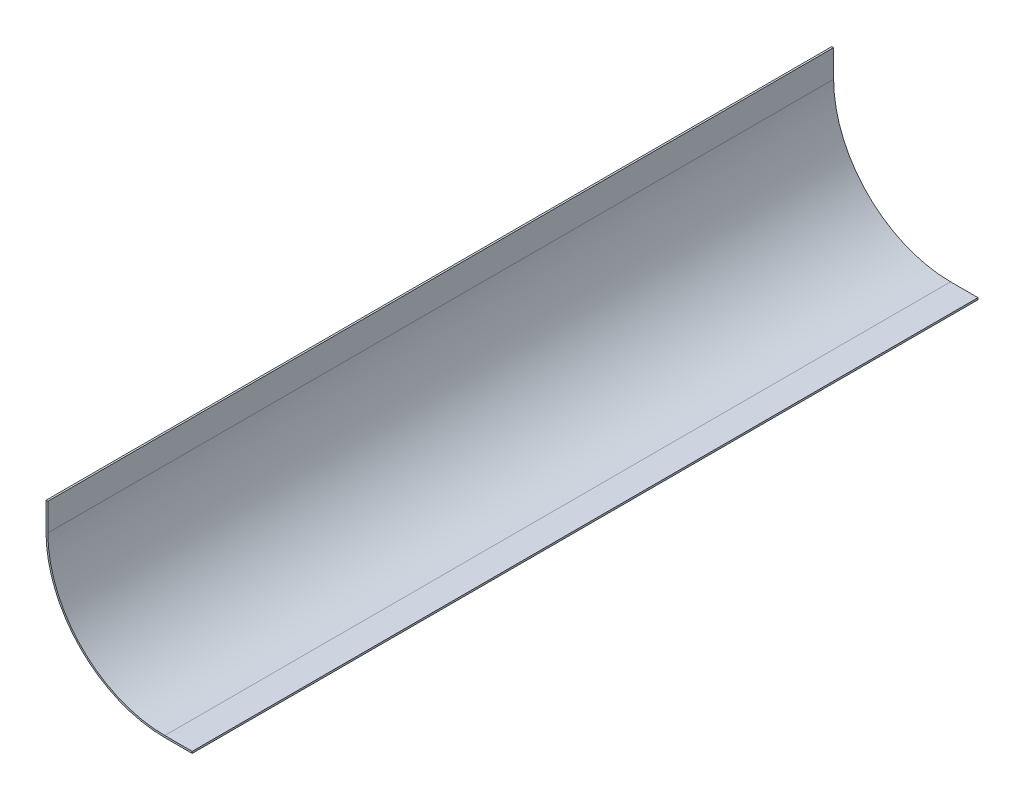
ISO-10303-21;
HEADER;
FILE_DESCRIPTION(('STEP AP214'),'2;1');
FILE_NAME('part.step','',(''),(''),'','','');
FILE_SCHEMA(('AUTOMOTIVE_DESIGN { 1 0 10303 214 1 1 1 1 }'));
ENDSEC;
DATA;
#1=APPLICATION_CONTEXT('core data for automotive mechanical design processes');
#2=APPLICATION_PROTOCOL_DEFINITION('international standard','automotive_design',2000,#1);
#3=PRODUCT_CONTEXT('',#1,'mechanical');
#4=PRODUCT('Part','Part','',(#3));
#5=PRODUCT_RELATED_PRODUCT_CATEGORY('part','',(#4));
#6=PRODUCT_DEFINITION_FORMATION('','',#4);
#7=PRODUCT_DEFINITION_CONTEXT('part definition',#1,'design');
#8=PRODUCT_DEFINITION('design','',#6,#7);
#9=PRODUCT_DEFINITION_SHAPE('','',#8);
#10=(LENGTH_UNIT() NAMED_UNIT(*) SI_UNIT(.MILLI.,.METRE.));
#11=(NAMED_UNIT(*) PLANE_ANGLE_UNIT() SI_UNIT($,.RADIAN.));
#12=(NAMED_UNIT(*) SI_UNIT($,.STERADIAN.) SOLID_ANGLE_UNIT());
#13=UNCERTAINTY_MEASURE_WITH_UNIT(LENGTH_MEASURE(1.E-05),#10,'distance_accuracy_value','');
#14=(GEOMETRIC_REPRESENTATION_CONTEXT(3) GLOBAL_UNCERTAINTY_ASSIGNED_CONTEXT((#13)) GLOBAL_UNIT_ASSIGNED_CONTEXT((#10,
#11,#12)) REPRESENTATION_CONTEXT('',''));
#15=CARTESIAN_POINT('',(0.,0.,0.));
#16=DIRECTION('',(0.,0.,1.));
#17=DIRECTION('',(1.,0.,0.));
#18=AXIS2_PLACEMENT_3D('',#15,#16,#17);
#19=CARTESIAN_POINT('',(-99.8198198198198,73.3333333333333,430.));
#20=DIRECTION('',(0.,-1.,0.));
#21=DIRECTION('',(0.,0.,-1.));
#22=AXIS2_PLACEMENT_3D('',#19,#20,#21);
#23=PLANE('',#22);
#24=DIRECTION('',(-1.,0.,0.));
#25=VECTOR('',#24,1.);
#26=CARTESIAN_POINT('',(-99.8198198198198,73.3333333333333,0.));
#27=LINE('',#26,#25);
#28=CARTESIAN_POINT('',(-98.8198198198198,73.3333333333333,0.));
#29=VERTEX_POINT('',#28);
#30=CARTESIAN_POINT('',(-99.8198198198198,73.3333333333333,0.));
#31=VERTEX_POINT('',#30);
#32=EDGE_CURVE('E129',#29,#31,#27,.T.);
#33=ORIENTED_EDGE('',*,*,#32,.T.);
#34=DIRECTION('',(0.,0.,-1.));
#35=VECTOR('',#34,1.);
#36=CARTESIAN_POINT('',(-99.8198198198198,73.3333333333333,430.));
#37=LINE('',#36,#35);
#38=CARTESIAN_POINT('',(-99.8198198198198,73.3333333333333,430.));
#39=VERTEX_POINT('',#38);
#40=EDGE_CURVE('E11',#39,#31,#37,.T.);
#41=ORIENTED_EDGE('',*,*,#40,.F.);
#42=DIRECTION('',(-1.,0.,0.));
#43=VECTOR('',#42,1.);
#44=CARTESIAN_POINT('',(-99.8198198198198,73.3333333333333,430.));
#45=LINE('',#44,#43);
#46=CARTESIAN_POINT('',(-98.8198198198198,73.3333333333333,430.));
#47=VERTEX_POINT('',#46);
#48=EDGE_CURVE('E143',#47,#39,#45,.T.);
#49=ORIENTED_EDGE('',*,*,#48,.F.);
#50=DIRECTION('',(0.,0.,-1.));
#51=VECTOR('',#50,1.);
#52=CARTESIAN_POINT('',(-98.8198198198198,73.3333333333333,430.));
#53=LINE('',#52,#51);
#54=EDGE_CURVE('E125',#47,#29,#53,.T.);
#55=ORIENTED_EDGE('',*,*,#54,.T.);
#56=EDGE_LOOP('',(#33,#41,#49,#55));
#57=FACE_BOUND('',#56,.T.);
#58=ADVANCED_FACE('F33',(#57),#23,.F.);
#59=CARTESIAN_POINT('',(-99.8198198198198,73.3333333333333,430.));
#60=DIRECTION('',(1.,0.,0.));
#61=DIRECTION('',(0.,0.,-1.));
#62=AXIS2_PLACEMENT_3D('',#59,#60,#61);
#63=PLANE('',#62);
#64=DIRECTION('',(0.,-1.,0.));
#65=VECTOR('',#64,1.);
#66=CARTESIAN_POINT('',(-99.8198198198198,73.3333333333333,0.));
#67=LINE('',#66,#65);
#68=CARTESIAN_POINT('',(-99.8198198198198,58.3333333333338,0.));
#69=VERTEX_POINT('',#68);
#70=EDGE_CURVE('E132',#31,#69,#67,.T.);
#71=ORIENTED_EDGE('',*,*,#70,.T.);
#72=DIRECTION('',(0.,0.,-1.));
#73=VECTOR('',#72,1.);
#74=CARTESIAN_POINT('',(-99.8198198198198,58.3333333333338,430.));
#75=LINE('',#74,#73);
#76=CARTESIAN_POINT('',(-99.8198198198198,58.3333333333338,430.));
#77=VERTEX_POINT('',#76);
#78=EDGE_CURVE('E41',#77,#69,#75,.T.);
#79=ORIENTED_EDGE('',*,*,#78,.F.);
#80=DIRECTION('',(0.,-1.,0.));
#81=VECTOR('',#80,1.);
#82=CARTESIAN_POINT('',(-99.8198198198198,73.3333333333333,430.));
#83=LINE('',#82,#81);
#84=EDGE_CURVE('E92',#39,#77,#83,.T.);
#85=ORIENTED_EDGE('',*,*,#84,.F.);
#86=ORIENTED_EDGE('',*,*,#40,.T.);
#87=EDGE_LOOP('',(#71,#79,#85,#86));
#88=FACE_BOUND('',#87,.T.);
#89=ADVANCED_FACE('F178',(#88),#63,.F.);
#90=CARTESIAN_POINT('',(-34.8198198198198,58.3333333333333,430.));
#91=DIRECTION('',(0.,0.,-1.));
#92=DIRECTION('',(-1.,0.,0.));
#93=AXIS2_PLACEMENT_3D('',#90,#91,#92);
#94=CYLINDRICAL_SURFACE('',#93,65.);
#95=CARTESIAN_POINT('',(-34.8198198198198,58.3333333333333,0.));
#96=DIRECTION('',(0.,0.,1.));
#97=DIRECTION('',(-1.,0.,0.));
#98=AXIS2_PLACEMENT_3D('',#95,#96,#97);
#99=CIRCLE('',#98,65.);
#100=CARTESIAN_POINT('',(-34.8198198198193,-6.66666666666667,0.));
#101=VERTEX_POINT('',#100);
#102=EDGE_CURVE('E134',#69,#101,#99,.T.);
#103=ORIENTED_EDGE('',*,*,#102,.T.);
#104=DIRECTION('',(0.,0.,-1.));
#105=VECTOR('',#104,1.);
#106=CARTESIAN_POINT('',(-34.8198198198193,-6.66666666666667,430.));
#107=LINE('',#106,#105);
#108=CARTESIAN_POINT('',(-34.8198198198193,-6.66666666666667,430.));
#109=VERTEX_POINT('',#108);
#110=EDGE_CURVE('E150',#109,#101,#107,.T.);
#111=ORIENTED_EDGE('',*,*,#110,.F.);
#112=CARTESIAN_POINT('',(-34.8198198198198,58.3333333333333,430.));
#113=DIRECTION('',(0.,0.,1.));
#114=DIRECTION('',(-1.,0.,0.));
#115=AXIS2_PLACEMENT_3D('',#112,#113,#114);
#116=CIRCLE('',#115,65.);
#117=EDGE_CURVE('E158',#77,#109,#116,.T.);
#118=ORIENTED_EDGE('',*,*,#117,.F.);
#119=ORIENTED_EDGE('',*,*,#78,.T.);
#120=EDGE_LOOP('',(#103,#111,#118,#119));
#121=FACE_BOUND('',#120,.T.);
#122=ADVANCED_FACE('F156',(#121),#94,.T.);
#123=CARTESIAN_POINT('',(-34.8198198198193,-6.66666666666666,430.));
#124=DIRECTION('',(0.,1.,0.));
#125=DIRECTION('',(0.,0.,1.));
#126=AXIS2_PLACEMENT_3D('',#123,#124,#125);
#127=PLANE('',#126);
#128=DIRECTION('',(1.,0.,0.));
#129=VECTOR('',#128,1.);
#130=CARTESIAN_POINT('',(-34.8198198198193,-6.66666666666666,0.));
#131=LINE('',#130,#129);
#132=CARTESIAN_POINT('',(-19.8198198198198,-6.66666666666666,0.));
#133=VERTEX_POINT('',#132);
#134=EDGE_CURVE('E136',#101,#133,#131,.T.);
#135=ORIENTED_EDGE('',*,*,#134,.T.);
#136=DIRECTION('',(0.,0.,-1.));
#137=VECTOR('',#136,1.);
#138=CARTESIAN_POINT('',(-19.8198198198198,-6.66666666666666,430.));
#139=LINE('',#138,#137);
#140=CARTESIAN_POINT('',(-19.8198198198198,-6.66666666666666,430.));
#141=VERTEX_POINT('',#140);
#142=EDGE_CURVE('E147',#141,#133,#139,.T.);
#143=ORIENTED_EDGE('',*,*,#142,.F.);
#144=DIRECTION('',(1.,0.,0.));
#145=VECTOR('',#144,1.);
#146=CARTESIAN_POINT('',(-34.8198198198193,-6.66666666666666,430.));
#147=LINE('',#146,#145);
#148=EDGE_CURVE('E170',#109,#141,#147,.T.);
#149=ORIENTED_EDGE('',*,*,#148,.F.);
#150=ORIENTED_EDGE('',*,*,#110,.T.);
#151=EDGE_LOOP('',(#135,#143,#149,#150));
#152=FACE_BOUND('',#151,.T.);
#153=ADVANCED_FACE('F166',(#152),#127,.F.);
#154=CARTESIAN_POINT('',(-19.8198198198198,-5.66666666666666,430.));
#155=DIRECTION('',(-1.,0.,0.));
#156=DIRECTION('',(0.,0.,1.));
#157=AXIS2_PLACEMENT_3D('',#154,#155,#156);
#158=PLANE('',#157);
#159=DIRECTION('',(0.,1.,0.));
#160=VECTOR('',#159,1.);
#161=CARTESIAN_POINT('',(-19.8198198198198,-5.66666666666666,0.));
#162=LINE('',#161,#160);
#163=CARTESIAN_POINT('',(-19.8198198198198,-5.66666666666666,0.));
#164=VERTEX_POINT('',#163);
#165=EDGE_CURVE('E138',#133,#164,#162,.T.);
#166=ORIENTED_EDGE('',*,*,#165,.T.);
#167=DIRECTION('',(0.,0.,-1.));
#168=VECTOR('',#167,1.);
#169=CARTESIAN_POINT('',(-19.8198198198198,-5.66666666666666,430.));
#170=LINE('',#169,#168);
#171=CARTESIAN_POINT('',(-19.8198198198198,-5.66666666666666,430.));
#172=VERTEX_POINT('',#171);
#173=EDGE_CURVE('E120',#172,#164,#170,.T.);
#174=ORIENTED_EDGE('',*,*,#173,.F.);
#175=DIRECTION('',(0.,1.,0.));
#176=VECTOR('',#175,1.);
#177=CARTESIAN_POINT('',(-19.8198198198198,-5.66666666666666,430.));
#178=LINE('',#177,#176);
#179=EDGE_CURVE('E111',#141,#172,#178,.T.);
#180=ORIENTED_EDGE('',*,*,#179,.F.);
#181=ORIENTED_EDGE('',*,*,#142,.T.);
#182=EDGE_LOOP('',(#166,#174,#180,#181));
#183=FACE_BOUND('',#182,.T.);
#184=ADVANCED_FACE('F169',(#183),#158,.F.);
#185=CARTESIAN_POINT('',(-34.8198198198193,-5.66666666666666,430.));
#186=DIRECTION('',(0.,-1.,0.));
#187=DIRECTION('',(0.,0.,-1.));
#188=AXIS2_PLACEMENT_3D('',#185,#186,#187);
#189=PLANE('',#188);
#190=DIRECTION('',(-1.,0.,0.));
#191=VECTOR('',#190,1.);
#192=CARTESIAN_POINT('',(-34.8198198198193,-5.66666666666666,0.));
#193=LINE('',#192,#191);
#194=CARTESIAN_POINT('',(-34.8198198198193,-5.66666666666666,0.));
#195=VERTEX_POINT('',#194);
#196=EDGE_CURVE('E119',#164,#195,#193,.T.);
#197=ORIENTED_EDGE('',*,*,#196,.T.);
#198=DIRECTION('',(0.,0.,-1.));
#199=VECTOR('',#198,1.);
#200=CARTESIAN_POINT('',(-34.8198198198193,-5.66666666666666,430.));
#201=LINE('',#200,#199);
#202=CARTESIAN_POINT('',(-34.8198198198193,-5.66666666666666,430.));
#203=VERTEX_POINT('',#202);
#204=EDGE_CURVE('E116',#203,#195,#201,.T.);
#205=ORIENTED_EDGE('',*,*,#204,.F.);
#206=DIRECTION('',(-1.,0.,0.));
#207=VECTOR('',#206,1.);
#208=CARTESIAN_POINT('',(-34.8198198198193,-5.66666666666666,430.));
#209=LINE('',#208,#207);
#210=EDGE_CURVE('E105',#172,#203,#209,.T.);
#211=ORIENTED_EDGE('',*,*,#210,.F.);
#212=ORIENTED_EDGE('',*,*,#173,.T.);
#213=EDGE_LOOP('',(#197,#205,#211,#212));
#214=FACE_BOUND('',#213,.T.);
#215=ADVANCED_FACE('F117',(#214),#189,.F.);
#216=CARTESIAN_POINT('',(-34.8198198198198,58.3333333333333,430.));
#217=DIRECTION('',(0.,0.,-1.));
#218=DIRECTION('',(-1.,0.,0.));
#219=AXIS2_PLACEMENT_3D('',#216,#217,#218);
#220=CYLINDRICAL_SURFACE('',#219,64.);
#221=CARTESIAN_POINT('',(-34.8198198198198,58.3333333333333,0.));
#222=DIRECTION('',(0.,0.,-1.));
#223=DIRECTION('',(-1.,0.,0.));
#224=AXIS2_PLACEMENT_3D('',#221,#222,#223);
#225=CIRCLE('',#224,64.);
#226=CARTESIAN_POINT('',(-98.8198198198198,58.3333333333333,0.));
#227=VERTEX_POINT('',#226);
#228=EDGE_CURVE('E78',#195,#227,#225,.T.);
#229=ORIENTED_EDGE('',*,*,#228,.T.);
#230=DIRECTION('',(0.,0.,-1.));
#231=VECTOR('',#230,1.);
#232=CARTESIAN_POINT('',(-98.8198198198198,58.3333333333333,430.));
#233=LINE('',#232,#231);
#234=CARTESIAN_POINT('',(-98.8198198198198,58.3333333333333,430.));
#235=VERTEX_POINT('',#234);
#236=EDGE_CURVE('E121',#235,#227,#233,.T.);
#237=ORIENTED_EDGE('',*,*,#236,.F.);
#238=CARTESIAN_POINT('',(-34.8198198198198,58.3333333333333,430.));
#239=DIRECTION('',(0.,0.,-1.));
#240=DIRECTION('',(-1.,0.,0.));
#241=AXIS2_PLACEMENT_3D('',#238,#239,#240);
#242=CIRCLE('',#241,64.);
#243=EDGE_CURVE('E109',#203,#235,#242,.T.);
#244=ORIENTED_EDGE('',*,*,#243,.F.);
#245=ORIENTED_EDGE('',*,*,#204,.T.);
#246=EDGE_LOOP('',(#229,#237,#244,#245));
#247=FACE_BOUND('',#246,.T.);
#248=ADVANCED_FACE('F123',(#247),#220,.F.);
#249=CARTESIAN_POINT('',(-98.8198198198198,73.3333333333333,430.));
#250=DIRECTION('',(-1.,0.,0.));
#251=DIRECTION('',(0.,0.,1.));
#252=AXIS2_PLACEMENT_3D('',#249,#250,#251);
#253=PLANE('',#252);
#254=DIRECTION('',(0.,1.,0.));
#255=VECTOR('',#254,1.);
#256=CARTESIAN_POINT('',(-98.8198198198198,73.3333333333333,0.));
#257=LINE('',#256,#255);
#258=EDGE_CURVE('E84',#227,#29,#257,.T.);
#259=ORIENTED_EDGE('',*,*,#258,.T.);
#260=ORIENTED_EDGE('',*,*,#54,.F.);
#261=DIRECTION('',(0.,1.,0.));
#262=VECTOR('',#261,1.);
#263=CARTESIAN_POINT('',(-98.8198198198198,73.3333333333333,430.));
#264=LINE('',#263,#262);
#265=EDGE_CURVE('E49',#235,#47,#264,.T.);
#266=ORIENTED_EDGE('',*,*,#265,.F.);
#267=ORIENTED_EDGE('',*,*,#236,.T.);
#268=EDGE_LOOP('',(#259,#260,#266,#267));
#269=FACE_BOUND('',#268,.T.);
#270=ADVANCED_FACE('F194',(#269),#253,.F.);
#271=CARTESIAN_POINT('',(-34.8198198198198,58.3333333333333,430.));
#272=DIRECTION('',(0.,0.,-1.));
#273=DIRECTION('',(-1.,0.,0.));
#274=AXIS2_PLACEMENT_3D('',#271,#272,#273);
#275=PLANE('',#274);
#276=ORIENTED_EDGE('',*,*,#48,.T.);
#277=ORIENTED_EDGE('',*,*,#84,.T.);
#278=ORIENTED_EDGE('',*,*,#117,.T.);
#279=ORIENTED_EDGE('',*,*,#148,.T.);
#280=ORIENTED_EDGE('',*,*,#179,.T.);
#281=ORIENTED_EDGE('',*,*,#210,.T.);
#282=ORIENTED_EDGE('',*,*,#243,.T.);
#283=ORIENTED_EDGE('',*,*,#265,.T.);
#284=EDGE_LOOP('',(#276,#277,#278,#279,#280,#281,#282,#283));
#285=FACE_BOUND('',#284,.T.);
#286=ADVANCED_FACE('F107',(#285),#275,.F.);
#287=CARTESIAN_POINT('',(-34.8198198198198,58.3333333333333,0.));
#288=DIRECTION('',(0.,0.,-1.));
#289=DIRECTION('',(-1.,0.,0.));
#290=AXIS2_PLACEMENT_3D('',#287,#288,#289);
#291=PLANE('',#290);
#292=ORIENTED_EDGE('',*,*,#32,.F.);
#293=ORIENTED_EDGE('',*,*,#258,.F.);
#294=ORIENTED_EDGE('',*,*,#228,.F.);
#295=ORIENTED_EDGE('',*,*,#196,.F.);
#296=ORIENTED_EDGE('',*,*,#165,.F.);
#297=ORIENTED_EDGE('',*,*,#134,.F.);
#298=ORIENTED_EDGE('',*,*,#102,.F.);
#299=ORIENTED_EDGE('',*,*,#70,.F.);
#300=EDGE_LOOP('',(#292,#293,#294,#295,#296,#297,#298,#299));
#301=FACE_BOUND('',#300,.T.);
#302=ADVANCED_FACE('F162',(#301),#291,.T.);
#303=CLOSED_SHELL('',(#58,#89,#122,#153,#184,#215,#248,#270,#286,#302));
#304=MANIFOLD_SOLID_BREP('B2',#303);
#305=ADVANCED_BREP_SHAPE_REPRESENTATION('',(#18,#304),#14);
#306=SHAPE_DEFINITION_REPRESENTATION(#9,#305);
ENDSEC;
END-ISO-10303-21;
